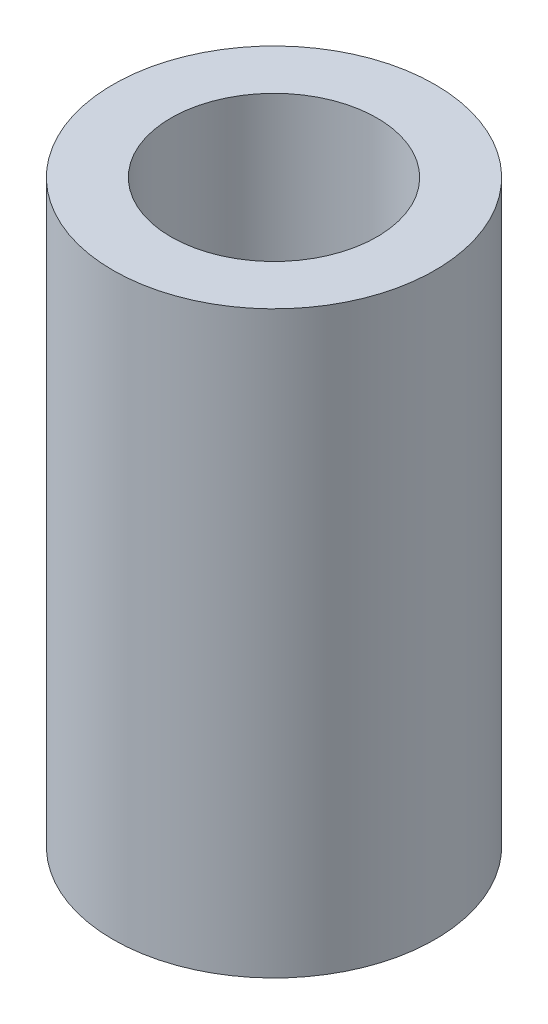
ISO-10303-21;
HEADER;
FILE_DESCRIPTION(('STEP AP214'),'2;1');
FILE_NAME('part.step','',(''),(''),'','','');
FILE_SCHEMA(('AUTOMOTIVE_DESIGN { 1 0 10303 214 1 1 1 1 }'));
ENDSEC;
DATA;
#1=APPLICATION_CONTEXT('core data for automotive mechanical design processes');
#2=APPLICATION_PROTOCOL_DEFINITION('international standard','automotive_design',2000,#1);
#3=PRODUCT_CONTEXT('',#1,'mechanical');
#4=PRODUCT('Part','Part','',(#3));
#5=PRODUCT_RELATED_PRODUCT_CATEGORY('part','',(#4));
#6=PRODUCT_DEFINITION_FORMATION('','',#4);
#7=PRODUCT_DEFINITION_CONTEXT('part definition',#1,'design');
#8=PRODUCT_DEFINITION('design','',#6,#7);
#9=PRODUCT_DEFINITION_SHAPE('','',#8);
#10=(LENGTH_UNIT() NAMED_UNIT(*) SI_UNIT(.MILLI.,.METRE.));
#11=(NAMED_UNIT(*) PLANE_ANGLE_UNIT() SI_UNIT($,.RADIAN.));
#12=(NAMED_UNIT(*) SI_UNIT($,.STERADIAN.) SOLID_ANGLE_UNIT());
#13=UNCERTAINTY_MEASURE_WITH_UNIT(LENGTH_MEASURE(1.E-05),#10,'distance_accuracy_value','');
#14=(GEOMETRIC_REPRESENTATION_CONTEXT(3) GLOBAL_UNCERTAINTY_ASSIGNED_CONTEXT((#13)) GLOBAL_UNIT_ASSIGNED_CONTEXT((#10,
#11,#12)) REPRESENTATION_CONTEXT('',''));
#15=CARTESIAN_POINT('',(0.,0.,0.));
#16=DIRECTION('',(0.,0.,1.));
#17=DIRECTION('',(1.,0.,0.));
#18=AXIS2_PLACEMENT_3D('',#15,#16,#17);
#19=CARTESIAN_POINT('',(0.,9.,0.));
#20=DIRECTION('',(0.,1.,0.));
#21=DIRECTION('',(0.,0.,1.));
#22=AXIS2_PLACEMENT_3D('',#19,#20,#21);
#23=PLANE('',#22);
#24=CARTESIAN_POINT('',(0.,9.,0.));
#25=DIRECTION('',(0.,1.,0.));
#26=DIRECTION('',(0.,0.,1.));
#27=AXIS2_PLACEMENT_3D('',#24,#25,#26);
#28=CIRCLE('',#27,2.5);
#29=CARTESIAN_POINT('',(0.,9.,2.5));
#30=VERTEX_POINT('',#29);
#31=EDGE_CURVE('E10',#30,#30,#28,.T.);
#32=ORIENTED_EDGE('',*,*,#31,.T.);
#33=EDGE_LOOP('',(#32));
#34=FACE_BOUND('',#33,.T.);
#35=CARTESIAN_POINT('',(0.,9.,0.));
#36=DIRECTION('',(0.,1.,0.));
#37=DIRECTION('',(0.,0.,1.));
#38=AXIS2_PLACEMENT_3D('',#35,#36,#37);
#39=CIRCLE('',#38,1.6);
#40=CARTESIAN_POINT('',(0.,9.,1.6));
#41=VERTEX_POINT('',#40);
#42=EDGE_CURVE('E44',#41,#41,#39,.T.);
#43=ORIENTED_EDGE('',*,*,#42,.F.);
#44=EDGE_LOOP('',(#43));
#45=FACE_BOUND('',#44,.T.);
#46=ADVANCED_FACE('F33',(#34,#45),#23,.T.);
#47=CARTESIAN_POINT('',(0.,0.,0.));
#48=DIRECTION('',(0.,1.,0.));
#49=DIRECTION('',(0.,0.,1.));
#50=AXIS2_PLACEMENT_3D('',#47,#48,#49);
#51=PLANE('',#50);
#52=CARTESIAN_POINT('',(0.,0.,0.));
#53=DIRECTION('',(0.,1.,0.));
#54=DIRECTION('',(0.,0.,1.));
#55=AXIS2_PLACEMENT_3D('',#52,#53,#54);
#56=CIRCLE('',#55,2.5);
#57=CARTESIAN_POINT('',(0.,0.,2.5));
#58=VERTEX_POINT('',#57);
#59=EDGE_CURVE('E37',#58,#58,#56,.T.);
#60=ORIENTED_EDGE('',*,*,#59,.F.);
#61=EDGE_LOOP('',(#60));
#62=FACE_BOUND('',#61,.T.);
#63=CARTESIAN_POINT('',(0.,0.,0.));
#64=DIRECTION('',(0.,1.,0.));
#65=DIRECTION('',(0.,0.,1.));
#66=AXIS2_PLACEMENT_3D('',#63,#64,#65);
#67=CIRCLE('',#66,1.6);
#68=CARTESIAN_POINT('',(0.,0.,1.6));
#69=VERTEX_POINT('',#68);
#70=EDGE_CURVE('E46',#69,#69,#67,.T.);
#71=ORIENTED_EDGE('',*,*,#70,.T.);
#72=EDGE_LOOP('',(#71));
#73=FACE_BOUND('',#72,.T.);
#74=ADVANCED_FACE('F56',(#62,#73),#51,.F.);
#75=CARTESIAN_POINT('',(0.,9.,0.));
#76=DIRECTION('',(0.,-1.,0.));
#77=DIRECTION('',(0.,0.,-1.));
#78=AXIS2_PLACEMENT_3D('',#75,#76,#77);
#79=CYLINDRICAL_SURFACE('',#78,2.5);
#80=ORIENTED_EDGE('',*,*,#31,.F.);
#81=EDGE_LOOP('',(#80));
#82=FACE_BOUND('',#81,.T.);
#83=ORIENTED_EDGE('',*,*,#59,.T.);
#84=EDGE_LOOP('',(#83));
#85=FACE_BOUND('',#84,.T.);
#86=ADVANCED_FACE('F35',(#82,#85),#79,.T.);
#87=CARTESIAN_POINT('',(0.,9.,0.));
#88=DIRECTION('',(0.,-1.,0.));
#89=DIRECTION('',(0.,0.,-1.));
#90=AXIS2_PLACEMENT_3D('',#87,#88,#89);
#91=CYLINDRICAL_SURFACE('',#90,1.6);
#92=ORIENTED_EDGE('',*,*,#42,.T.);
#93=EDGE_LOOP('',(#92));
#94=FACE_BOUND('',#93,.T.);
#95=ORIENTED_EDGE('',*,*,#70,.F.);
#96=EDGE_LOOP('',(#95));
#97=FACE_BOUND('',#96,.T.);
#98=ADVANCED_FACE('F52',(#94,#97),#91,.F.);
#99=CLOSED_SHELL('',(#46,#74,#86,#98));
#100=MANIFOLD_SOLID_BREP('B2',#99);
#101=ADVANCED_BREP_SHAPE_REPRESENTATION('',(#18,#100),#14);
#102=SHAPE_DEFINITION_REPRESENTATION(#9,#101);
ENDSEC;
END-ISO-10303-21;
